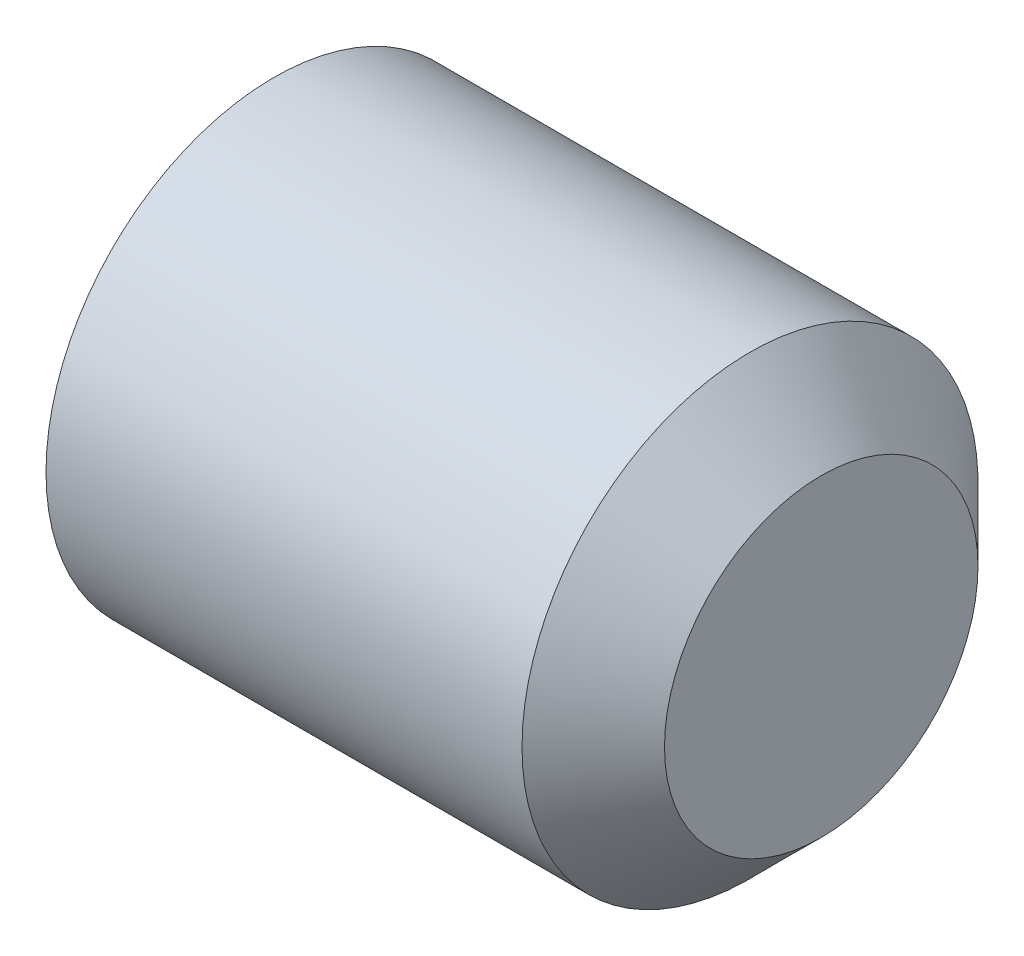
ISO-10303-21;
HEADER;
FILE_DESCRIPTION(('STEP AP214'),'2;1');
FILE_NAME('part.step','',(''),(''),'','','');
FILE_SCHEMA(('AUTOMOTIVE_DESIGN { 1 0 10303 214 1 1 1 1 }'));
ENDSEC;
DATA;
#1=APPLICATION_CONTEXT('core data for automotive mechanical design processes');
#2=APPLICATION_PROTOCOL_DEFINITION('international standard','automotive_design',2000,#1);
#3=PRODUCT_CONTEXT('',#1,'mechanical');
#4=PRODUCT('Part','Part','',(#3));
#5=PRODUCT_RELATED_PRODUCT_CATEGORY('part','',(#4));
#6=PRODUCT_DEFINITION_FORMATION('','',#4);
#7=PRODUCT_DEFINITION_CONTEXT('part definition',#1,'design');
#8=PRODUCT_DEFINITION('design','',#6,#7);
#9=PRODUCT_DEFINITION_SHAPE('','',#8);
#10=(LENGTH_UNIT() NAMED_UNIT(*) SI_UNIT(.MILLI.,.METRE.));
#11=(NAMED_UNIT(*) PLANE_ANGLE_UNIT() SI_UNIT($,.RADIAN.));
#12=(NAMED_UNIT(*) SI_UNIT($,.STERADIAN.) SOLID_ANGLE_UNIT());
#13=UNCERTAINTY_MEASURE_WITH_UNIT(LENGTH_MEASURE(1.E-05),#10,'distance_accuracy_value','');
#14=(GEOMETRIC_REPRESENTATION_CONTEXT(3) GLOBAL_UNCERTAINTY_ASSIGNED_CONTEXT((#13)) GLOBAL_UNIT_ASSIGNED_CONTEXT((#10,
#11,#12)) REPRESENTATION_CONTEXT('',''));
#15=CARTESIAN_POINT('',(0.,0.,0.));
#16=DIRECTION('',(0.,0.,1.));
#17=DIRECTION('',(1.,0.,0.));
#18=AXIS2_PLACEMENT_3D('',#15,#16,#17);
#19=CARTESIAN_POINT('',(0.,0.,0.));
#20=DIRECTION('',(-1.,0.,0.));
#21=DIRECTION('',(0.,0.,1.));
#22=AXIS2_PLACEMENT_3D('',#19,#20,#21);
#23=PLANE('',#22);
#24=CARTESIAN_POINT('',(0.,0.,0.));
#25=DIRECTION('',(-1.,0.,0.));
#26=DIRECTION('',(0.,0.,1.));
#27=AXIS2_PLACEMENT_3D('',#24,#25,#26);
#28=CIRCLE('',#27,3.3095);
#29=CARTESIAN_POINT('',(0.,0.,3.3095));
#30=VERTEX_POINT('',#29);
#31=EDGE_CURVE('E133',#30,#30,#28,.T.);
#32=ORIENTED_EDGE('',*,*,#31,.T.);
#33=EDGE_LOOP('',(#32));
#34=FACE_BOUND('',#33,.T.);
#35=DIRECTION('',(0.,0.,-1.));
#36=VECTOR('',#35,1.);
#37=CARTESIAN_POINT('',(0.,2.,1.15470053837925));
#38=LINE('',#37,#36);
#39=CARTESIAN_POINT('',(0.,2.,1.15470053837925));
#40=VERTEX_POINT('',#39);
#41=CARTESIAN_POINT('',(0.,2.,-1.15470053837925));
#42=VERTEX_POINT('',#41);
#43=EDGE_CURVE('E124',#40,#42,#38,.T.);
#44=ORIENTED_EDGE('',*,*,#43,.F.);
#45=DIRECTION('',(0.,-0.866025403784439,0.5));
#46=VECTOR('',#45,1.);
#47=CARTESIAN_POINT('',(0.,2.,1.15470053837925));
#48=LINE('',#47,#46);
#49=CARTESIAN_POINT('',(0.,0.,2.3094010767585));
#50=VERTEX_POINT('',#49);
#51=EDGE_CURVE('E46',#40,#50,#48,.T.);
#52=ORIENTED_EDGE('',*,*,#51,.T.);
#53=DIRECTION('',(0.,0.866025403784439,0.5));
#54=VECTOR('',#53,1.);
#55=CARTESIAN_POINT('',(0.,-2.,1.15470053837925));
#56=LINE('',#55,#54);
#57=CARTESIAN_POINT('',(0.,-2.,1.15470053837925));
#58=VERTEX_POINT('',#57);
#59=EDGE_CURVE('E115',#58,#50,#56,.T.);
#60=ORIENTED_EDGE('',*,*,#59,.F.);
#61=DIRECTION('',(0.,0.,-1.));
#62=VECTOR('',#61,1.);
#63=CARTESIAN_POINT('',(0.,-2.,1.15470053837925));
#64=LINE('',#63,#62);
#65=CARTESIAN_POINT('',(0.,-2.,-1.15470053837925));
#66=VERTEX_POINT('',#65);
#67=EDGE_CURVE('E118',#58,#66,#64,.T.);
#68=ORIENTED_EDGE('',*,*,#67,.T.);
#69=DIRECTION('',(0.,0.866025403784439,-0.5));
#70=VECTOR('',#69,1.);
#71=CARTESIAN_POINT('',(0.,-2.,-1.15470053837925));
#72=LINE('',#71,#70);
#73=CARTESIAN_POINT('',(0.,0.,-2.30940107675851));
#74=VERTEX_POINT('',#73);
#75=EDGE_CURVE('E121',#66,#74,#72,.T.);
#76=ORIENTED_EDGE('',*,*,#75,.T.);
#77=DIRECTION('',(0.,-0.866025403784439,-0.5));
#78=VECTOR('',#77,1.);
#79=CARTESIAN_POINT('',(0.,2.,-1.15470053837925));
#80=LINE('',#79,#78);
#81=EDGE_CURVE('E104',#42,#74,#80,.T.);
#82=ORIENTED_EDGE('',*,*,#81,.F.);
#83=EDGE_LOOP('',(#44,#52,#60,#68,#76,#82));
#84=FACE_BOUND('',#83,.T.);
#85=ADVANCED_FACE('F31',(#34,#84),#23,.T.);
#86=CARTESIAN_POINT('',(10.,2.75,0.));
#87=DIRECTION('',(1.,0.,0.));
#88=DIRECTION('',(0.,0.,-1.));
#89=AXIS2_PLACEMENT_3D('',#86,#87,#88);
#90=PLANE('',#89);
#91=CARTESIAN_POINT('',(10.,0.,0.));
#92=DIRECTION('',(-1.,0.,0.));
#93=DIRECTION('',(0.,0.,1.));
#94=AXIS2_PLACEMENT_3D('',#91,#92,#93);
#95=CIRCLE('',#94,2.75);
#96=CARTESIAN_POINT('',(10.,0.,2.75));
#97=VERTEX_POINT('',#96);
#98=EDGE_CURVE('E11',#97,#97,#95,.T.);
#99=ORIENTED_EDGE('',*,*,#98,.F.);
#100=EDGE_LOOP('',(#99));
#101=FACE_BOUND('',#100,.T.);
#102=ADVANCED_FACE('F33',(#101),#90,.T.);
#103=CARTESIAN_POINT('',(8.75000000000001,0.,0.));
#104=DIRECTION('',(-1.,0.,0.));
#105=DIRECTION('',(0.,0.,1.));
#106=AXIS2_PLACEMENT_3D('',#103,#104,#105);
#107=CONICAL_SURFACE('',#106,4.,0.785398163397453);
#108=ORIENTED_EDGE('',*,*,#98,.T.);
#109=EDGE_LOOP('',(#108));
#110=FACE_BOUND('',#109,.T.);
#111=CARTESIAN_POINT('',(8.75000000000001,0.,0.));
#112=DIRECTION('',(-1.,0.,0.));
#113=DIRECTION('',(0.,0.,1.));
#114=AXIS2_PLACEMENT_3D('',#111,#112,#113);
#115=CIRCLE('',#114,4.);
#116=CARTESIAN_POINT('',(8.75000000000001,0.,4.));
#117=VERTEX_POINT('',#116);
#118=EDGE_CURVE('E39',#117,#117,#115,.T.);
#119=ORIENTED_EDGE('',*,*,#118,.F.);
#120=EDGE_LOOP('',(#119));
#121=FACE_BOUND('',#120,.T.);
#122=ADVANCED_FACE('F144',(#110,#121),#107,.T.);
#123=CARTESIAN_POINT('',(-12.7,0.,0.));
#124=DIRECTION('',(-1.,0.,0.));
#125=DIRECTION('',(0.,0.,1.));
#126=AXIS2_PLACEMENT_3D('',#123,#124,#125);
#127=CYLINDRICAL_SURFACE('',#126,4.);
#128=ORIENTED_EDGE('',*,*,#118,.T.);
#129=EDGE_LOOP('',(#128));
#130=FACE_BOUND('',#129,.T.);
#131=CARTESIAN_POINT('',(0.398660360875434,0.,0.));
#132=DIRECTION('',(-1.,0.,0.));
#133=DIRECTION('',(0.,0.,1.));
#134=AXIS2_PLACEMENT_3D('',#131,#132,#133);
#135=CIRCLE('',#134,4.);
#136=CARTESIAN_POINT('',(0.398660360875434,0.,4.));
#137=VERTEX_POINT('',#136);
#138=EDGE_CURVE('E136',#137,#137,#135,.T.);
#139=ORIENTED_EDGE('',*,*,#138,.F.);
#140=EDGE_LOOP('',(#139));
#141=FACE_BOUND('',#140,.T.);
#142=ADVANCED_FACE('F141',(#130,#141),#127,.T.);
#143=CARTESIAN_POINT('',(0.,0.,0.));
#144=DIRECTION('',(1.,0.,0.));
#145=DIRECTION('',(0.,0.,-1.));
#146=AXIS2_PLACEMENT_3D('',#143,#144,#145);
#147=CONICAL_SURFACE('',#146,3.3095,1.0471975511966);
#148=ORIENTED_EDGE('',*,*,#138,.T.);
#149=EDGE_LOOP('',(#148));
#150=FACE_BOUND('',#149,.T.);
#151=ORIENTED_EDGE('',*,*,#31,.F.);
#152=EDGE_LOOP('',(#151));
#153=FACE_BOUND('',#152,.T.);
#154=ADVANCED_FACE('F151',(#150,#153),#147,.T.);
#155=CARTESIAN_POINT('',(5.,2.,1.15470053837925));
#156=DIRECTION('',(0.,-0.5,-0.866025403784439));
#157=DIRECTION('',(0.,0.866025403784439,-0.5));
#158=AXIS2_PLACEMENT_3D('',#155,#156,#157);
#159=PLANE('',#158);
#160=ORIENTED_EDGE('',*,*,#51,.F.);
#161=DIRECTION('',(-1.,0.,0.));
#162=VECTOR('',#161,1.);
#163=CARTESIAN_POINT('',(5.,2.,1.15470053837925));
#164=LINE('',#163,#162);
#165=CARTESIAN_POINT('',(5.,2.,1.15470053837925));
#166=VERTEX_POINT('',#165);
#167=EDGE_CURVE('E51',#166,#40,#164,.T.);
#168=ORIENTED_EDGE('',*,*,#167,.F.);
#169=DIRECTION('',(0.,-0.866025403784439,0.5));
#170=VECTOR('',#169,1.);
#171=CARTESIAN_POINT('',(5.,2.,1.15470053837925));
#172=LINE('',#171,#170);
#173=CARTESIAN_POINT('',(5.,0.,2.3094010767585));
#174=VERTEX_POINT('',#173);
#175=EDGE_CURVE('E78',#166,#174,#172,.T.);
#176=ORIENTED_EDGE('',*,*,#175,.T.);
#177=DIRECTION('',(-1.,0.,0.));
#178=VECTOR('',#177,1.);
#179=CARTESIAN_POINT('',(5.,0.,2.3094010767585));
#180=LINE('',#179,#178);
#181=EDGE_CURVE('E131',#174,#50,#180,.T.);
#182=ORIENTED_EDGE('',*,*,#181,.T.);
#183=EDGE_LOOP('',(#160,#168,#176,#182));
#184=FACE_BOUND('',#183,.T.);
#185=ADVANCED_FACE('F162',(#184),#159,.T.);
#186=CARTESIAN_POINT('',(5.,-2.,1.15470053837925));
#187=DIRECTION('',(0.,-0.5,0.866025403784439));
#188=DIRECTION('',(0.,-0.866025403784439,-0.5));
#189=AXIS2_PLACEMENT_3D('',#186,#187,#188);
#190=PLANE('',#189);
#191=ORIENTED_EDGE('',*,*,#59,.T.);
#192=ORIENTED_EDGE('',*,*,#181,.F.);
#193=DIRECTION('',(0.,0.866025403784439,0.5));
#194=VECTOR('',#193,1.);
#195=CARTESIAN_POINT('',(5.,-2.,1.15470053837925));
#196=LINE('',#195,#194);
#197=CARTESIAN_POINT('',(5.,-2.,1.15470053837925));
#198=VERTEX_POINT('',#197);
#199=EDGE_CURVE('E260',#198,#174,#196,.T.);
#200=ORIENTED_EDGE('',*,*,#199,.F.);
#201=DIRECTION('',(-1.,0.,0.));
#202=VECTOR('',#201,1.);
#203=CARTESIAN_POINT('',(5.,-2.,1.15470053837925));
#204=LINE('',#203,#202);
#205=EDGE_CURVE('E129',#198,#58,#204,.T.);
#206=ORIENTED_EDGE('',*,*,#205,.T.);
#207=EDGE_LOOP('',(#191,#192,#200,#206));
#208=FACE_BOUND('',#207,.T.);
#209=ADVANCED_FACE('F169',(#208),#190,.F.);
#210=CARTESIAN_POINT('',(5.,-2.,1.15470053837925));
#211=DIRECTION('',(0.,1.,0.));
#212=DIRECTION('',(0.,0.,1.));
#213=AXIS2_PLACEMENT_3D('',#210,#211,#212);
#214=PLANE('',#213);
#215=ORIENTED_EDGE('',*,*,#67,.F.);
#216=ORIENTED_EDGE('',*,*,#205,.F.);
#217=DIRECTION('',(0.,0.,-1.));
#218=VECTOR('',#217,1.);
#219=CARTESIAN_POINT('',(5.,-2.,1.15470053837925));
#220=LINE('',#219,#218);
#221=CARTESIAN_POINT('',(5.,-2.,-1.15470053837925));
#222=VERTEX_POINT('',#221);
#223=EDGE_CURVE('E99',#198,#222,#220,.T.);
#224=ORIENTED_EDGE('',*,*,#223,.T.);
#225=DIRECTION('',(-1.,0.,0.));
#226=VECTOR('',#225,1.);
#227=CARTESIAN_POINT('',(5.,-2.,-1.15470053837925));
#228=LINE('',#227,#226);
#229=EDGE_CURVE('E94',#222,#66,#228,.T.);
#230=ORIENTED_EDGE('',*,*,#229,.T.);
#231=EDGE_LOOP('',(#215,#216,#224,#230));
#232=FACE_BOUND('',#231,.T.);
#233=ADVANCED_FACE('F176',(#232),#214,.T.);
#234=CARTESIAN_POINT('',(5.,-2.,-1.15470053837925));
#235=DIRECTION('',(0.,0.5,0.866025403784439));
#236=DIRECTION('',(0.,-0.866025403784439,0.5));
#237=AXIS2_PLACEMENT_3D('',#234,#235,#236);
#238=PLANE('',#237);
#239=ORIENTED_EDGE('',*,*,#75,.F.);
#240=ORIENTED_EDGE('',*,*,#229,.F.);
#241=DIRECTION('',(0.,0.866025403784439,-0.5));
#242=VECTOR('',#241,1.);
#243=CARTESIAN_POINT('',(5.,-2.,-1.15470053837925));
#244=LINE('',#243,#242);
#245=CARTESIAN_POINT('',(5.,0.,-2.30940107675851));
#246=VERTEX_POINT('',#245);
#247=EDGE_CURVE('E89',#222,#246,#244,.T.);
#248=ORIENTED_EDGE('',*,*,#247,.T.);
#249=DIRECTION('',(-1.,0.,0.));
#250=VECTOR('',#249,1.);
#251=CARTESIAN_POINT('',(5.,0.,-2.30940107675851));
#252=LINE('',#251,#250);
#253=EDGE_CURVE('E93',#246,#74,#252,.T.);
#254=ORIENTED_EDGE('',*,*,#253,.T.);
#255=EDGE_LOOP('',(#239,#240,#248,#254));
#256=FACE_BOUND('',#255,.T.);
#257=ADVANCED_FACE('F92',(#256),#238,.T.);
#258=CARTESIAN_POINT('',(5.,2.,-1.15470053837925));
#259=DIRECTION('',(0.,0.5,-0.866025403784439));
#260=DIRECTION('',(0.,0.866025403784439,0.5));
#261=AXIS2_PLACEMENT_3D('',#258,#259,#260);
#262=PLANE('',#261);
#263=ORIENTED_EDGE('',*,*,#81,.T.);
#264=ORIENTED_EDGE('',*,*,#253,.F.);
#265=DIRECTION('',(0.,-0.866025403784439,-0.5));
#266=VECTOR('',#265,1.);
#267=CARTESIAN_POINT('',(5.,2.,-1.15470053837925));
#268=LINE('',#267,#266);
#269=CARTESIAN_POINT('',(5.,2.,-1.15470053837925));
#270=VERTEX_POINT('',#269);
#271=EDGE_CURVE('E98',#270,#246,#268,.T.);
#272=ORIENTED_EDGE('',*,*,#271,.F.);
#273=DIRECTION('',(-1.,0.,0.));
#274=VECTOR('',#273,1.);
#275=CARTESIAN_POINT('',(5.,2.,-1.15470053837925));
#276=LINE('',#275,#274);
#277=EDGE_CURVE('E74',#270,#42,#276,.T.);
#278=ORIENTED_EDGE('',*,*,#277,.T.);
#279=EDGE_LOOP('',(#263,#264,#272,#278));
#280=FACE_BOUND('',#279,.T.);
#281=ADVANCED_FACE('F101',(#280),#262,.F.);
#282=CARTESIAN_POINT('',(5.,2.,1.15470053837925));
#283=DIRECTION('',(0.,1.,0.));
#284=DIRECTION('',(0.,0.,1.));
#285=AXIS2_PLACEMENT_3D('',#282,#283,#284);
#286=PLANE('',#285);
#287=ORIENTED_EDGE('',*,*,#43,.T.);
#288=ORIENTED_EDGE('',*,*,#277,.F.);
#289=DIRECTION('',(0.,0.,-1.));
#290=VECTOR('',#289,1.);
#291=CARTESIAN_POINT('',(5.,2.,1.15470053837925));
#292=LINE('',#291,#290);
#293=EDGE_CURVE('E109',#166,#270,#292,.T.);
#294=ORIENTED_EDGE('',*,*,#293,.F.);
#295=ORIENTED_EDGE('',*,*,#167,.T.);
#296=EDGE_LOOP('',(#287,#288,#294,#295));
#297=FACE_BOUND('',#296,.T.);
#298=ADVANCED_FACE('F188',(#297),#286,.F.);
#299=CARTESIAN_POINT('',(5.,2.,1.15470053837925));
#300=DIRECTION('',(1.,0.,0.));
#301=DIRECTION('',(0.,0.,-1.));
#302=AXIS2_PLACEMENT_3D('',#299,#300,#301);
#303=PLANE('',#302);
#304=ORIENTED_EDGE('',*,*,#175,.F.);
#305=ORIENTED_EDGE('',*,*,#293,.T.);
#306=ORIENTED_EDGE('',*,*,#271,.T.);
#307=ORIENTED_EDGE('',*,*,#247,.F.);
#308=ORIENTED_EDGE('',*,*,#223,.F.);
#309=ORIENTED_EDGE('',*,*,#199,.T.);
#310=EDGE_LOOP('',(#304,#305,#306,#307,#308,#309));
#311=FACE_BOUND('',#310,.T.);
#312=ADVANCED_FACE('F107',(#311),#303,.F.);
#313=CLOSED_SHELL('',(#85,#102,#122,#142,#154,#185,#209,#233,#257,#281,#298,#312));
#314=MANIFOLD_SOLID_BREP('B2',#313);
#315=ADVANCED_BREP_SHAPE_REPRESENTATION('',(#18,#314),#14);
#316=SHAPE_DEFINITION_REPRESENTATION(#9,#315);
ENDSEC;
END-ISO-10303-21;
